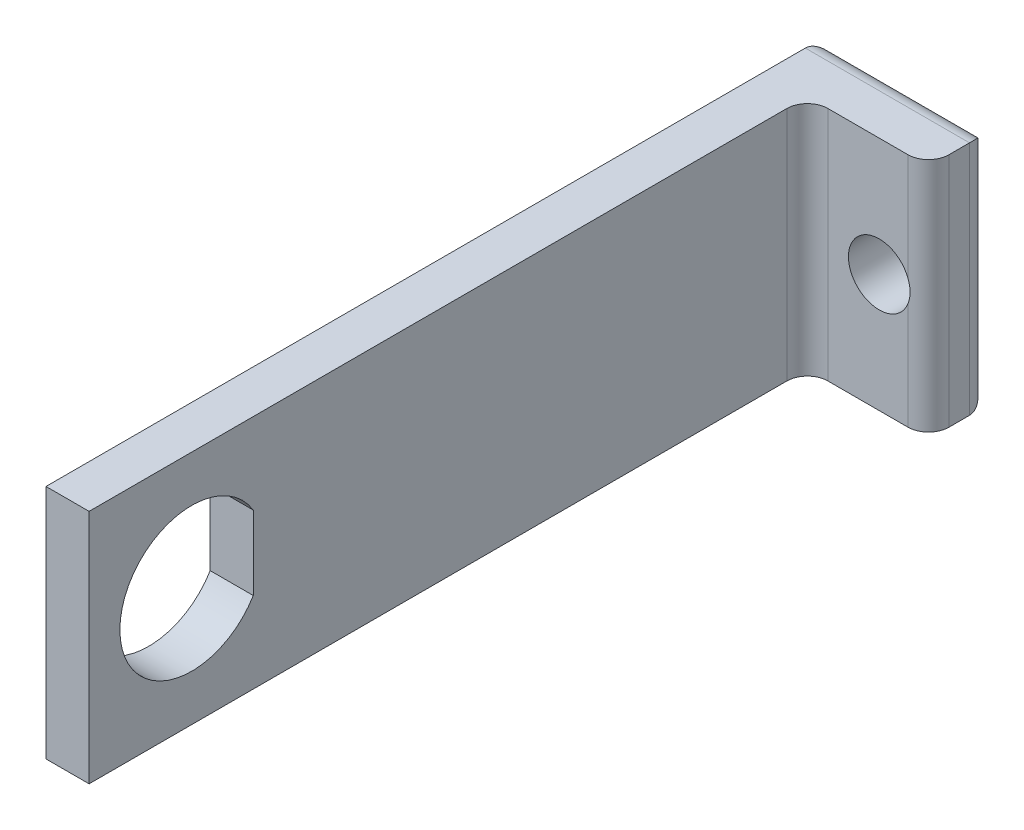
ISO-10303-21;
HEADER;
FILE_DESCRIPTION(('STEP AP214'),'2;1');
FILE_NAME('part.step','',(''),(''),'','','');
FILE_SCHEMA(('AUTOMOTIVE_DESIGN { 1 0 10303 214 1 1 1 1 }'));
ENDSEC;
DATA;
#1=APPLICATION_CONTEXT('core data for automotive mechanical design processes');
#2=APPLICATION_PROTOCOL_DEFINITION('international standard','automotive_design',2000,#1);
#3=PRODUCT_CONTEXT('',#1,'mechanical');
#4=PRODUCT('Part','Part','',(#3));
#5=PRODUCT_RELATED_PRODUCT_CATEGORY('part','',(#4));
#6=PRODUCT_DEFINITION_FORMATION('','',#4);
#7=PRODUCT_DEFINITION_CONTEXT('part definition',#1,'design');
#8=PRODUCT_DEFINITION('design','',#6,#7);
#9=PRODUCT_DEFINITION_SHAPE('','',#8);
#10=(LENGTH_UNIT() NAMED_UNIT(*) SI_UNIT(.MILLI.,.METRE.));
#11=(NAMED_UNIT(*) PLANE_ANGLE_UNIT() SI_UNIT($,.RADIAN.));
#12=(NAMED_UNIT(*) SI_UNIT($,.STERADIAN.) SOLID_ANGLE_UNIT());
#13=UNCERTAINTY_MEASURE_WITH_UNIT(LENGTH_MEASURE(1.E-05),#10,'distance_accuracy_value','');
#14=(GEOMETRIC_REPRESENTATION_CONTEXT(3) GLOBAL_UNCERTAINTY_ASSIGNED_CONTEXT((#13)) GLOBAL_UNIT_ASSIGNED_CONTEXT((#10,
#11,#12)) REPRESENTATION_CONTEXT('',''));
#15=CARTESIAN_POINT('',(0.,0.,0.));
#16=DIRECTION('',(0.,0.,1.));
#17=DIRECTION('',(1.,0.,0.));
#18=AXIS2_PLACEMENT_3D('',#15,#16,#17);
#19=CARTESIAN_POINT('',(-19.5,11.5,-3.));
#20=DIRECTION('',(1.,0.,0.));
#21=DIRECTION('',(0.,0.,-1.));
#22=AXIS2_PLACEMENT_3D('',#19,#20,#21);
#23=PLANE('',#22);
#24=DIRECTION('',(0.,-1.,0.));
#25=VECTOR('',#24,1.);
#26=CARTESIAN_POINT('',(-19.5,3.947224362268,27.));
#27=LINE('',#26,#25);
#28=CARTESIAN_POINT('',(-19.5,7.552775637732,27.));
#29=VERTEX_POINT('',#28);
#30=CARTESIAN_POINT('',(-19.5,3.947224362268,27.));
#31=VERTEX_POINT('',#30);
#32=EDGE_CURVE('E159',#29,#31,#27,.T.);
#33=ORIENTED_EDGE('',*,*,#32,.F.);
#34=CARTESIAN_POINT('',(-19.5,5.75,30.));
#35=DIRECTION('',(-1.,0.,0.));
#36=DIRECTION('',(0.,0.,1.));
#37=AXIS2_PLACEMENT_3D('',#34,#35,#36);
#38=CIRCLE('',#37,3.5);
#39=EDGE_CURVE('E153',#31,#29,#38,.T.);
#40=ORIENTED_EDGE('',*,*,#39,.F.);
#41=EDGE_LOOP('',(#33,#40));
#42=FACE_BOUND('',#41,.T.);
#43=DIRECTION('',(0.,0.,1.));
#44=VECTOR('',#43,1.);
#45=CARTESIAN_POINT('',(-19.5,11.5,-3.));
#46=LINE('',#45,#44);
#47=CARTESIAN_POINT('',(-19.5,11.5,-2.));
#48=VERTEX_POINT('',#47);
#49=CARTESIAN_POINT('',(-19.5,11.5,35.));
#50=VERTEX_POINT('',#49);
#51=EDGE_CURVE('E190',#48,#50,#46,.T.);
#52=ORIENTED_EDGE('',*,*,#51,.F.);
#53=DIRECTION('',(0.,-1.,0.));
#54=VECTOR('',#53,1.);
#55=CARTESIAN_POINT('',(-19.5,11.5,-2.));
#56=LINE('',#55,#54);
#57=CARTESIAN_POINT('',(-19.5,0.,-2.));
#58=VERTEX_POINT('',#57);
#59=EDGE_CURVE('E324',#48,#58,#56,.T.);
#60=ORIENTED_EDGE('',*,*,#59,.T.);
#61=DIRECTION('',(0.,0.,1.));
#62=VECTOR('',#61,1.);
#63=CARTESIAN_POINT('',(-19.5,0.,-3.));
#64=LINE('',#63,#62);
#65=CARTESIAN_POINT('',(-19.5,0.,35.));
#66=VERTEX_POINT('',#65);
#67=EDGE_CURVE('E189',#58,#66,#64,.T.);
#68=ORIENTED_EDGE('',*,*,#67,.T.);
#69=DIRECTION('',(0.,-1.,0.));
#70=VECTOR('',#69,1.);
#71=CARTESIAN_POINT('',(-19.5,11.5,35.));
#72=LINE('',#71,#70);
#73=EDGE_CURVE('E227',#50,#66,#72,.T.);
#74=ORIENTED_EDGE('',*,*,#73,.F.);
#75=EDGE_LOOP('',(#52,#60,#68,#74));
#76=FACE_BOUND('',#75,.T.);
#77=ADVANCED_FACE('F45',(#42,#76),#23,.F.);
#78=CARTESIAN_POINT('',(-19.5,11.5,35.));
#79=DIRECTION('',(0.,0.,-1.));
#80=DIRECTION('',(-1.,0.,0.));
#81=AXIS2_PLACEMENT_3D('',#78,#79,#80);
#82=PLANE('',#81);
#83=DIRECTION('',(1.,0.,0.));
#84=VECTOR('',#83,1.);
#85=CARTESIAN_POINT('',(-19.5,0.,35.));
#86=LINE('',#85,#84);
#87=CARTESIAN_POINT('',(-17.4,0.,35.));
#88=VERTEX_POINT('',#87);
#89=EDGE_CURVE('E212',#66,#88,#86,.T.);
#90=ORIENTED_EDGE('',*,*,#89,.T.);
#91=DIRECTION('',(0.,-1.,0.));
#92=VECTOR('',#91,1.);
#93=CARTESIAN_POINT('',(-17.4,11.5,35.));
#94=LINE('',#93,#92);
#95=CARTESIAN_POINT('',(-17.4,11.5,35.));
#96=VERTEX_POINT('',#95);
#97=EDGE_CURVE('E209',#96,#88,#94,.T.);
#98=ORIENTED_EDGE('',*,*,#97,.F.);
#99=DIRECTION('',(1.,0.,0.));
#100=VECTOR('',#99,1.);
#101=CARTESIAN_POINT('',(-19.5,11.5,35.));
#102=LINE('',#101,#100);
#103=EDGE_CURVE('E193',#50,#96,#102,.T.);
#104=ORIENTED_EDGE('',*,*,#103,.F.);
#105=ORIENTED_EDGE('',*,*,#73,.T.);
#106=EDGE_LOOP('',(#90,#98,#104,#105));
#107=FACE_BOUND('',#106,.T.);
#108=ADVANCED_FACE('F294',(#107),#82,.F.);
#109=CARTESIAN_POINT('',(-17.4,11.5,35.));
#110=DIRECTION('',(-1.,0.,0.));
#111=DIRECTION('',(0.,0.,1.));
#112=AXIS2_PLACEMENT_3D('',#109,#110,#111);
#113=PLANE('',#112);
#114=DIRECTION('',(0.,1.,0.));
#115=VECTOR('',#114,1.);
#116=CARTESIAN_POINT('',(-17.4,3.947224362268,27.));
#117=LINE('',#116,#115);
#118=CARTESIAN_POINT('',(-17.4,3.947224362268,27.));
#119=VERTEX_POINT('',#118);
#120=CARTESIAN_POINT('',(-17.4,7.552775637732,27.));
#121=VERTEX_POINT('',#120);
#122=EDGE_CURVE('E162',#119,#121,#117,.T.);
#123=ORIENTED_EDGE('',*,*,#122,.F.);
#124=CARTESIAN_POINT('',(-17.4,5.75,30.));
#125=DIRECTION('',(-1.,0.,0.));
#126=DIRECTION('',(0.,0.,1.));
#127=AXIS2_PLACEMENT_3D('',#124,#125,#126);
#128=CIRCLE('',#127,3.5);
#129=EDGE_CURVE('E150',#121,#119,#128,.F.);
#130=ORIENTED_EDGE('',*,*,#129,.F.);
#131=EDGE_LOOP('',(#123,#130));
#132=FACE_BOUND('',#131,.T.);
#133=DIRECTION('',(0.,0.,-1.));
#134=VECTOR('',#133,1.);
#135=CARTESIAN_POINT('',(-17.4,0.,35.));
#136=LINE('',#135,#134);
#137=CARTESIAN_POINT('',(-17.4,0.,1.));
#138=VERTEX_POINT('',#137);
#139=EDGE_CURVE('E215',#88,#138,#136,.T.);
#140=ORIENTED_EDGE('',*,*,#139,.T.);
#141=DIRECTION('',(0.,-1.,0.));
#142=VECTOR('',#141,1.);
#143=CARTESIAN_POINT('',(-17.4,11.5,1.));
#144=LINE('',#143,#142);
#145=CARTESIAN_POINT('',(-17.4,11.5,1.));
#146=VERTEX_POINT('',#145);
#147=EDGE_CURVE('E349',#138,#146,#144,.F.);
#148=ORIENTED_EDGE('',*,*,#147,.T.);
#149=DIRECTION('',(0.,0.,-1.));
#150=VECTOR('',#149,1.);
#151=CARTESIAN_POINT('',(-17.4,11.5,35.));
#152=LINE('',#151,#150);
#153=EDGE_CURVE('E197',#96,#146,#152,.T.);
#154=ORIENTED_EDGE('',*,*,#153,.F.);
#155=ORIENTED_EDGE('',*,*,#97,.T.);
#156=EDGE_LOOP('',(#140,#148,#154,#155));
#157=FACE_BOUND('',#156,.T.);
#158=ADVANCED_FACE('F168',(#132,#157),#113,.F.);
#159=CARTESIAN_POINT('',(-17.4,11.5,0.));
#160=DIRECTION('',(0.,0.,-1.));
#161=DIRECTION('',(-1.,0.,0.));
#162=AXIS2_PLACEMENT_3D('',#159,#160,#161);
#163=PLANE('',#162);
#164=DIRECTION('',(1.,0.,0.));
#165=VECTOR('',#164,1.);
#166=CARTESIAN_POINT('',(-17.4,0.,0.));
#167=LINE('',#166,#165);
#168=CARTESIAN_POINT('',(-16.4,0.,0.));
#169=VERTEX_POINT('',#168);
#170=CARTESIAN_POINT('',(-12.5,0.,0.));
#171=VERTEX_POINT('',#170);
#172=EDGE_CURVE('E218',#169,#171,#167,.T.);
#173=ORIENTED_EDGE('',*,*,#172,.T.);
#174=DIRECTION('',(0.,-1.,0.));
#175=VECTOR('',#174,1.);
#176=CARTESIAN_POINT('',(-12.5,11.5,0.));
#177=LINE('',#176,#175);
#178=CARTESIAN_POINT('',(-12.5,5.21148351928656,0.));
#179=VERTEX_POINT('',#178);
#180=EDGE_CURVE('E346',#171,#179,#177,.F.);
#181=ORIENTED_EDGE('',*,*,#180,.T.);
#182=CARTESIAN_POINT('',(-13.9,5.75,0.));
#183=DIRECTION('',(0.,0.,-1.));
#184=DIRECTION('',(-1.,0.,0.));
#185=AXIS2_PLACEMENT_3D('',#182,#183,#184);
#186=CIRCLE('',#185,1.5);
#187=CARTESIAN_POINT('',(-12.5,6.28851648071344,0.));
#188=VERTEX_POINT('',#187);
#189=EDGE_CURVE('E185',#188,#179,#186,.F.);
#190=ORIENTED_EDGE('',*,*,#189,.F.);
#191=DIRECTION('',(0.,-1.,0.));
#192=VECTOR('',#191,1.);
#193=CARTESIAN_POINT('',(-12.5,11.5,0.));
#194=LINE('',#193,#192);
#195=CARTESIAN_POINT('',(-12.5,11.5,0.));
#196=VERTEX_POINT('',#195);
#197=EDGE_CURVE('E339',#188,#196,#194,.F.);
#198=ORIENTED_EDGE('',*,*,#197,.T.);
#199=DIRECTION('',(1.,0.,0.));
#200=VECTOR('',#199,1.);
#201=CARTESIAN_POINT('',(-17.4,11.5,0.));
#202=LINE('',#201,#200);
#203=CARTESIAN_POINT('',(-16.4,11.5,0.));
#204=VERTEX_POINT('',#203);
#205=EDGE_CURVE('E201',#204,#196,#202,.T.);
#206=ORIENTED_EDGE('',*,*,#205,.F.);
#207=DIRECTION('',(0.,-1.,0.));
#208=VECTOR('',#207,1.);
#209=CARTESIAN_POINT('',(-16.4,0.,0.));
#210=LINE('',#209,#208);
#211=EDGE_CURVE('E334',#204,#169,#210,.T.);
#212=ORIENTED_EDGE('',*,*,#211,.T.);
#213=EDGE_LOOP('',(#173,#181,#190,#198,#206,#212));
#214=FACE_BOUND('',#213,.T.);
#215=ADVANCED_FACE('F287',(#214),#163,.F.);
#216=CARTESIAN_POINT('',(-11.5,11.5,-3.));
#217=DIRECTION('',(-1.,0.,0.));
#218=DIRECTION('',(0.,0.,1.));
#219=AXIS2_PLACEMENT_3D('',#216,#217,#218);
#220=PLANE('',#219);
#221=DIRECTION('',(0.,0.,-1.));
#222=VECTOR('',#221,1.);
#223=CARTESIAN_POINT('',(-11.5,0.,-3.));
#224=LINE('',#223,#222);
#225=CARTESIAN_POINT('',(-11.5,0.,-1.));
#226=VERTEX_POINT('',#225);
#227=CARTESIAN_POINT('',(-11.5,0.,-2.));
#228=VERTEX_POINT('',#227);
#229=EDGE_CURVE('E194',#226,#228,#224,.T.);
#230=ORIENTED_EDGE('',*,*,#229,.T.);
#231=DIRECTION('',(0.,-1.,0.));
#232=VECTOR('',#231,1.);
#233=CARTESIAN_POINT('',(-11.5,11.5,-2.));
#234=LINE('',#233,#232);
#235=CARTESIAN_POINT('',(-11.5,11.5,-2.));
#236=VERTEX_POINT('',#235);
#237=EDGE_CURVE('E362',#228,#236,#234,.F.);
#238=ORIENTED_EDGE('',*,*,#237,.T.);
#239=DIRECTION('',(0.,0.,-1.));
#240=VECTOR('',#239,1.);
#241=CARTESIAN_POINT('',(-11.5,11.5,-3.));
#242=LINE('',#241,#240);
#243=CARTESIAN_POINT('',(-11.5,11.5,-1.));
#244=VERTEX_POINT('',#243);
#245=EDGE_CURVE('E205',#244,#236,#242,.T.);
#246=ORIENTED_EDGE('',*,*,#245,.F.);
#247=DIRECTION('',(0.,-1.,0.));
#248=VECTOR('',#247,1.);
#249=CARTESIAN_POINT('',(-11.5,11.5,-1.));
#250=LINE('',#249,#248);
#251=EDGE_CURVE('E373',#244,#226,#250,.T.);
#252=ORIENTED_EDGE('',*,*,#251,.T.);
#253=EDGE_LOOP('',(#230,#238,#246,#252));
#254=FACE_BOUND('',#253,.T.);
#255=ADVANCED_FACE('F283',(#254),#220,.F.);
#256=CARTESIAN_POINT('',(-19.5,11.5,-3.));
#257=DIRECTION('',(0.,0.,1.));
#258=DIRECTION('',(1.,0.,0.));
#259=AXIS2_PLACEMENT_3D('',#256,#257,#258);
#260=PLANE('',#259);
#261=DIRECTION('',(-1.,0.,0.));
#262=VECTOR('',#261,1.);
#263=CARTESIAN_POINT('',(-11.5,10.5,-3.));
#264=LINE('',#263,#262);
#265=CARTESIAN_POINT('',(-18.5,10.5,-3.));
#266=VERTEX_POINT('',#265);
#267=CARTESIAN_POINT('',(-12.5,10.5,-3.));
#268=VERTEX_POINT('',#267);
#269=EDGE_CURVE('E237',#266,#268,#264,.F.);
#270=ORIENTED_EDGE('',*,*,#269,.T.);
#271=DIRECTION('',(0.,-1.,0.));
#272=VECTOR('',#271,1.);
#273=CARTESIAN_POINT('',(-12.5,11.5,-3.));
#274=LINE('',#273,#272);
#275=CARTESIAN_POINT('',(-12.5,6.28851648071344,-3.));
#276=VERTEX_POINT('',#275);
#277=EDGE_CURVE('E243',#268,#276,#274,.T.);
#278=ORIENTED_EDGE('',*,*,#277,.T.);
#279=CARTESIAN_POINT('',(-13.9,5.75,-3.));
#280=DIRECTION('',(0.,0.,-1.));
#281=DIRECTION('',(-1.,0.,0.));
#282=AXIS2_PLACEMENT_3D('',#279,#280,#281);
#283=CIRCLE('',#282,1.5);
#284=CARTESIAN_POINT('',(-12.5,5.21148351928656,-3.));
#285=VERTEX_POINT('',#284);
#286=EDGE_CURVE('E166',#285,#276,#283,.T.);
#287=ORIENTED_EDGE('',*,*,#286,.F.);
#288=DIRECTION('',(0.,-1.,0.));
#289=VECTOR('',#288,1.);
#290=CARTESIAN_POINT('',(-12.5,11.5,-3.));
#291=LINE('',#290,#289);
#292=CARTESIAN_POINT('',(-12.5,1.,-3.));
#293=VERTEX_POINT('',#292);
#294=EDGE_CURVE('E240',#285,#293,#291,.T.);
#295=ORIENTED_EDGE('',*,*,#294,.T.);
#296=DIRECTION('',(-1.,0.,0.));
#297=VECTOR('',#296,1.);
#298=CARTESIAN_POINT('',(-19.5,1.,-3.));
#299=LINE('',#298,#297);
#300=CARTESIAN_POINT('',(-18.5,1.,-3.));
#301=VERTEX_POINT('',#300);
#302=EDGE_CURVE('E231',#293,#301,#299,.T.);
#303=ORIENTED_EDGE('',*,*,#302,.T.);
#304=DIRECTION('',(0.,-1.,0.));
#305=VECTOR('',#304,1.);
#306=CARTESIAN_POINT('',(-18.5,11.5,-3.));
#307=LINE('',#306,#305);
#308=EDGE_CURVE('E234',#301,#266,#307,.F.);
#309=ORIENTED_EDGE('',*,*,#308,.T.);
#310=EDGE_LOOP('',(#270,#278,#287,#295,#303,#309));
#311=FACE_BOUND('',#310,.T.);
#312=ADVANCED_FACE('F277',(#311),#260,.F.);
#313=CARTESIAN_POINT('',(0.,11.5,0.));
#314=DIRECTION('',(0.,1.,0.));
#315=DIRECTION('',(0.,0.,1.));
#316=AXIS2_PLACEMENT_3D('',#313,#314,#315);
#317=PLANE('',#316);
#318=ORIENTED_EDGE('',*,*,#245,.T.);
#319=DIRECTION('',(-1.,0.,0.));
#320=VECTOR('',#319,1.);
#321=CARTESIAN_POINT('',(-19.5,11.5,-2.));
#322=LINE('',#321,#320);
#323=EDGE_CURVE('E364',#236,#48,#322,.T.);
#324=ORIENTED_EDGE('',*,*,#323,.T.);
#325=ORIENTED_EDGE('',*,*,#51,.T.);
#326=ORIENTED_EDGE('',*,*,#103,.T.);
#327=ORIENTED_EDGE('',*,*,#153,.T.);
#328=CARTESIAN_POINT('',(-16.4,11.5,1.));
#329=DIRECTION('',(0.,1.,0.));
#330=DIRECTION('',(0.,0.,1.));
#331=AXIS2_PLACEMENT_3D('',#328,#329,#330);
#332=CIRCLE('',#331,1.);
#333=EDGE_CURVE('E11',#146,#204,#332,.F.);
#334=ORIENTED_EDGE('',*,*,#333,.T.);
#335=ORIENTED_EDGE('',*,*,#205,.T.);
#336=CARTESIAN_POINT('',(-12.5,11.5,-1.));
#337=DIRECTION('',(0.,1.,0.));
#338=DIRECTION('',(0.,0.,1.));
#339=AXIS2_PLACEMENT_3D('',#336,#337,#338);
#340=CIRCLE('',#339,1.);
#341=EDGE_CURVE('E367',#196,#244,#340,.T.);
#342=ORIENTED_EDGE('',*,*,#341,.T.);
#343=EDGE_LOOP('',(#318,#324,#325,#326,#327,#334,#335,#342));
#344=FACE_BOUND('',#343,.T.);
#345=ADVANCED_FACE('F273',(#344),#317,.T.);
#346=CARTESIAN_POINT('',(0.,0.,0.));
#347=DIRECTION('',(0.,1.,0.));
#348=DIRECTION('',(0.,0.,1.));
#349=AXIS2_PLACEMENT_3D('',#346,#347,#348);
#350=PLANE('',#349);
#351=ORIENTED_EDGE('',*,*,#67,.F.);
#352=DIRECTION('',(-1.,0.,0.));
#353=VECTOR('',#352,1.);
#354=CARTESIAN_POINT('',(0.,0.,-2.));
#355=LINE('',#354,#353);
#356=EDGE_CURVE('E329',#58,#228,#355,.F.);
#357=ORIENTED_EDGE('',*,*,#356,.T.);
#358=ORIENTED_EDGE('',*,*,#229,.F.);
#359=CARTESIAN_POINT('',(-12.5,0.,-1.));
#360=DIRECTION('',(0.,1.,0.));
#361=DIRECTION('',(0.,0.,1.));
#362=AXIS2_PLACEMENT_3D('',#359,#360,#361);
#363=CIRCLE('',#362,1.);
#364=EDGE_CURVE('E68',#226,#171,#363,.F.);
#365=ORIENTED_EDGE('',*,*,#364,.T.);
#366=ORIENTED_EDGE('',*,*,#172,.F.);
#367=CARTESIAN_POINT('',(-16.4,0.,1.));
#368=DIRECTION('',(0.,1.,0.));
#369=DIRECTION('',(0.,0.,1.));
#370=AXIS2_PLACEMENT_3D('',#367,#368,#369);
#371=CIRCLE('',#370,1.);
#372=EDGE_CURVE('E55',#169,#138,#371,.T.);
#373=ORIENTED_EDGE('',*,*,#372,.T.);
#374=ORIENTED_EDGE('',*,*,#139,.F.);
#375=ORIENTED_EDGE('',*,*,#89,.F.);
#376=EDGE_LOOP('',(#351,#357,#358,#365,#366,#373,#374,#375));
#377=FACE_BOUND('',#376,.T.);
#378=ADVANCED_FACE('F270',(#377),#350,.F.);
#379=CARTESIAN_POINT('',(-13.9,5.75,35.001));
#380=DIRECTION('',(0.,0.,-1.));
#381=DIRECTION('',(-1.,0.,0.));
#382=AXIS2_PLACEMENT_3D('',#379,#380,#381);
#383=CYLINDRICAL_SURFACE('',#382,1.5);
#384=ORIENTED_EDGE('',*,*,#286,.T.);
#385=CARTESIAN_POINT('',(-12.5,6.28851648071344,-3.));
#386=CARTESIAN_POINT('',(-12.4847524389628,6.24888809709415,-2.9999833071484));
#387=CARTESIAN_POINT('',(-12.4711968424512,6.20861419954741,-2.99965076639667));
#388=CARTESIAN_POINT('',(-12.4475462421582,6.12706431958614,-2.99869788182376));
#389=CARTESIAN_POINT('',(-12.4374513420944,6.08578830717777,-2.99807752937814));
#390=CARTESIAN_POINT('',(-12.4207902623054,6.00247825190098,-2.99689228346156));
#391=CARTESIAN_POINT('',(-12.4142281046814,5.9604434010928,-2.99632745379972));
#392=CARTESIAN_POINT('',(-12.4046949271355,5.87597911515038,-2.99545846176344));
#393=CARTESIAN_POINT('',(-12.4017235756206,5.83354971681532,-2.99515427532067));
#394=CARTESIAN_POINT('',(-12.3982581028327,5.70677619568702,-2.99482455883384));
#395=CARTESIAN_POINT('',(-12.403070569133,5.62223038628245,-2.99536691017937));
#396=CARTESIAN_POINT('',(-12.4268155784703,5.45536723976206,-2.99738528797825));
#397=CARTESIAN_POINT('',(-12.4457095353143,5.37304444871404,-2.99885876128984));
#398=CARTESIAN_POINT('',(-12.4757037720479,5.27926736023096,-2.99971357748911));
#399=CARTESIAN_POINT('',(-12.480291751397,5.26560677575193,-2.99981683556918));
#400=CARTESIAN_POINT('',(-12.4898553249586,5.23843517698418,-2.9999603527412));
#401=CARTESIAN_POINT('',(-12.4948305738705,5.22492404144739,-3.00000066729494));
#402=CARTESIAN_POINT('',(-12.5,5.21148351928656,-3.));
#403=B_SPLINE_CURVE_WITH_KNOTS('',3,(#385,#386,#387,#388,#389,#390,#391,#392,#393,#394,#395,
#396,#397,#398,#399,#400,#401,#402),.UNSPECIFIED.,.F.,.F.,(4,2,2,2,2,2,2,2,4),(0.,
0.127334925114758,0.254673666142173,0.382157080021365,0.509628720549113,0.762409365491733,
1.0144998743038,1.05772998228611,1.10092197714101),.UNSPECIFIED.);
#404=EDGE_CURVE('E255',#276,#285,#403,.T.);
#405=ORIENTED_EDGE('',*,*,#404,.T.);
#406=EDGE_LOOP('',(#384,#405));
#407=FACE_BOUND('',#406,.T.);
#408=ORIENTED_EDGE('',*,*,#189,.T.);
#409=CARTESIAN_POINT('',(-12.5,5.21148351928656,0.));
#410=CARTESIAN_POINT('',(-12.4847524389628,5.25111190290585,-1.66928515980216E-05));
#411=CARTESIAN_POINT('',(-12.4711968424512,5.29138580045258,-0.000349233603334194));
#412=CARTESIAN_POINT('',(-12.4475462421582,5.37293568041385,-0.00130211817623948));
#413=CARTESIAN_POINT('',(-12.4374513420944,5.41421169282223,-0.00192247062185586));
#414=CARTESIAN_POINT('',(-12.4207902623054,5.49752174809902,-0.00310771653843662));
#415=CARTESIAN_POINT('',(-12.4142281046814,5.5395565989072,-0.00367254620027921));
#416=CARTESIAN_POINT('',(-12.4046949271355,5.62402088484961,-0.00454153823655973));
#417=CARTESIAN_POINT('',(-12.4017235756206,5.66645028318468,-0.00484572467933216));
#418=CARTESIAN_POINT('',(-12.3982581028327,5.79322380431297,-0.00517544116616162));
#419=CARTESIAN_POINT('',(-12.403070569133,5.87776961371755,-0.00463308982063139));
#420=CARTESIAN_POINT('',(-12.4268155784703,6.04463276023794,-0.00261471202175018));
#421=CARTESIAN_POINT('',(-12.4457095353143,6.12695555128596,-0.00114123871016219));
#422=CARTESIAN_POINT('',(-12.4757037720479,6.22073263976904,-0.000286422510892083));
#423=CARTESIAN_POINT('',(-12.480291751397,6.23439322424807,-0.000183164430822718));
#424=CARTESIAN_POINT('',(-12.4898553249586,6.26156482301582,-3.96472587988669E-05));
#425=CARTESIAN_POINT('',(-12.4948305738705,6.27507595855262,6.67294937058742E-07));
#426=CARTESIAN_POINT('',(-12.5,6.28851648071344,0.));
#427=B_SPLINE_CURVE_WITH_KNOTS('',3,(#409,#410,#411,#412,#413,#414,#415,#416,#417,#418,#419,
#420,#421,#422,#423,#424,#425,#426),.UNSPECIFIED.,.F.,.F.,(4,2,2,2,2,2,2,2,4),(0.,
0.127334925114759,0.254673666142174,0.382157080021366,0.509628720549114,0.762409365491734,
1.0144998743038,1.05772998228611,1.10092197714102),.UNSPECIFIED.);
#428=EDGE_CURVE('E247',#179,#188,#427,.T.);
#429=ORIENTED_EDGE('',*,*,#428,.T.);
#430=EDGE_LOOP('',(#408,#429));
#431=FACE_BOUND('',#430,.T.);
#432=ADVANCED_FACE('F265',(#407,#431),#383,.F.);
#433=CARTESIAN_POINT('',(-11.499,5.75,30.));
#434=DIRECTION('',(-1.,0.,0.));
#435=DIRECTION('',(0.,0.,1.));
#436=AXIS2_PLACEMENT_3D('',#433,#434,#435);
#437=CYLINDRICAL_SURFACE('',#436,3.5);
#438=ORIENTED_EDGE('',*,*,#129,.T.);
#439=DIRECTION('',(-1.,0.,0.));
#440=VECTOR('',#439,1.);
#441=CARTESIAN_POINT('',(-11.499,3.947224362268,27.));
#442=LINE('',#441,#440);
#443=EDGE_CURVE('E158',#119,#31,#442,.T.);
#444=ORIENTED_EDGE('',*,*,#443,.T.);
#445=ORIENTED_EDGE('',*,*,#39,.T.);
#446=DIRECTION('',(-1.,0.,0.));
#447=VECTOR('',#446,1.);
#448=CARTESIAN_POINT('',(-11.499,7.552775637732,27.));
#449=LINE('',#448,#447);
#450=EDGE_CURVE('E146',#121,#29,#449,.T.);
#451=ORIENTED_EDGE('',*,*,#450,.F.);
#452=EDGE_LOOP('',(#438,#444,#445,#451));
#453=FACE_BOUND('',#452,.T.);
#454=ADVANCED_FACE('F148',(#453),#437,.F.);
#455=CARTESIAN_POINT('',(-11.499,3.947224362268,27.));
#456=DIRECTION('',(0.,0.,-1.));
#457=DIRECTION('',(-1.,0.,0.));
#458=AXIS2_PLACEMENT_3D('',#455,#456,#457);
#459=PLANE('',#458);
#460=ORIENTED_EDGE('',*,*,#122,.T.);
#461=ORIENTED_EDGE('',*,*,#450,.T.);
#462=ORIENTED_EDGE('',*,*,#32,.T.);
#463=ORIENTED_EDGE('',*,*,#443,.F.);
#464=EDGE_LOOP('',(#460,#461,#462,#463));
#465=FACE_BOUND('',#464,.T.);
#466=ADVANCED_FACE('F163',(#465),#459,.F.);
#467=CARTESIAN_POINT('',(-18.5,11.5,-2.));
#468=DIRECTION('',(0.,-1.,0.));
#469=DIRECTION('',(0.,0.,-1.));
#470=AXIS2_PLACEMENT_3D('',#467,#468,#469);
#471=CYLINDRICAL_SURFACE('',#470,1.);
#472=CARTESIAN_POINT('',(-18.5,1.,-2.));
#473=DIRECTION('',(-0.707106781186547,0.707106781186547,0.));
#474=DIRECTION('',(-0.707106781186547,-0.707106781186547,0.));
#475=AXIS2_PLACEMENT_3D('',#472,#473,#474);
#476=ELLIPSE('',#475,1.41421356237309,1.);
#477=EDGE_CURVE('E176',#58,#301,#476,.F.);
#478=ORIENTED_EDGE('',*,*,#477,.F.);
#479=ORIENTED_EDGE('',*,*,#59,.F.);
#480=CARTESIAN_POINT('',(-18.5,10.5,-2.));
#481=DIRECTION('',(-0.707106781186547,-0.707106781186547,0.));
#482=DIRECTION('',(0.707106781186547,-0.707106781186547,0.));
#483=AXIS2_PLACEMENT_3D('',#480,#481,#482);
#484=ELLIPSE('',#483,1.41421356237309,1.);
#485=EDGE_CURVE('E49',#266,#48,#484,.F.);
#486=ORIENTED_EDGE('',*,*,#485,.F.);
#487=ORIENTED_EDGE('',*,*,#308,.F.);
#488=EDGE_LOOP('',(#478,#479,#486,#487));
#489=FACE_BOUND('',#488,.T.);
#490=ADVANCED_FACE('F311',(#489),#471,.T.);
#491=CARTESIAN_POINT('',(0.,10.5,-2.));
#492=DIRECTION('',(1.,0.,0.));
#493=DIRECTION('',(0.,0.,-1.));
#494=AXIS2_PLACEMENT_3D('',#491,#492,#493);
#495=CYLINDRICAL_SURFACE('',#494,1.);
#496=ORIENTED_EDGE('',*,*,#485,.T.);
#497=ORIENTED_EDGE('',*,*,#323,.F.);
#498=CARTESIAN_POINT('',(-12.5,10.5,-2.));
#499=DIRECTION('',(0.707106781186547,-0.707106781186547,0.));
#500=DIRECTION('',(0.707106781186547,0.707106781186547,0.));
#501=AXIS2_PLACEMENT_3D('',#498,#499,#500);
#502=ELLIPSE('',#501,1.41421356237309,1.);
#503=EDGE_CURVE('E327',#268,#236,#502,.T.);
#504=ORIENTED_EDGE('',*,*,#503,.F.);
#505=ORIENTED_EDGE('',*,*,#269,.F.);
#506=EDGE_LOOP('',(#496,#497,#504,#505));
#507=FACE_BOUND('',#506,.T.);
#508=ADVANCED_FACE('F308',(#507),#495,.T.);
#509=CARTESIAN_POINT('',(-19.5,1.,-2.));
#510=DIRECTION('',(-1.,0.,0.));
#511=DIRECTION('',(0.,0.,1.));
#512=AXIS2_PLACEMENT_3D('',#509,#510,#511);
#513=CYLINDRICAL_SURFACE('',#512,1.);
#514=ORIENTED_EDGE('',*,*,#477,.T.);
#515=ORIENTED_EDGE('',*,*,#302,.F.);
#516=CARTESIAN_POINT('',(-12.5,1.,-2.));
#517=DIRECTION('',(-0.707106781186547,-0.707106781186547,0.));
#518=DIRECTION('',(-0.707106781186547,0.707106781186547,0.));
#519=AXIS2_PLACEMENT_3D('',#516,#517,#518);
#520=ELLIPSE('',#519,1.41421356237309,1.);
#521=EDGE_CURVE('E331',#228,#293,#520,.F.);
#522=ORIENTED_EDGE('',*,*,#521,.F.);
#523=ORIENTED_EDGE('',*,*,#356,.F.);
#524=EDGE_LOOP('',(#514,#515,#522,#523));
#525=FACE_BOUND('',#524,.T.);
#526=ADVANCED_FACE('F304',(#525),#513,.T.);
#527=CARTESIAN_POINT('',(-12.5,11.5,-2.));
#528=DIRECTION('',(0.,-1.,0.));
#529=DIRECTION('',(0.,0.,-1.));
#530=AXIS2_PLACEMENT_3D('',#527,#528,#529);
#531=CYLINDRICAL_SURFACE('',#530,1.);
#532=ORIENTED_EDGE('',*,*,#503,.T.);
#533=ORIENTED_EDGE('',*,*,#237,.F.);
#534=ORIENTED_EDGE('',*,*,#521,.T.);
#535=ORIENTED_EDGE('',*,*,#294,.F.);
#536=ORIENTED_EDGE('',*,*,#404,.F.);
#537=ORIENTED_EDGE('',*,*,#277,.F.);
#538=EDGE_LOOP('',(#532,#533,#534,#535,#536,#537));
#539=FACE_BOUND('',#538,.T.);
#540=ADVANCED_FACE('F300',(#539),#531,.T.);
#541=CARTESIAN_POINT('',(-12.5,11.5,-1.));
#542=DIRECTION('',(0.,-1.,0.));
#543=DIRECTION('',(0.,0.,-1.));
#544=AXIS2_PLACEMENT_3D('',#541,#542,#543);
#545=CYLINDRICAL_SURFACE('',#544,1.);
#546=ORIENTED_EDGE('',*,*,#428,.F.);
#547=ORIENTED_EDGE('',*,*,#180,.F.);
#548=ORIENTED_EDGE('',*,*,#364,.F.);
#549=ORIENTED_EDGE('',*,*,#251,.F.);
#550=ORIENTED_EDGE('',*,*,#341,.F.);
#551=ORIENTED_EDGE('',*,*,#197,.F.);
#552=EDGE_LOOP('',(#546,#547,#548,#549,#550,#551));
#553=FACE_BOUND('',#552,.T.);
#554=ADVANCED_FACE('F262',(#553),#545,.T.);
#555=CARTESIAN_POINT('',(-16.4,11.5,1.));
#556=DIRECTION('',(0.,1.,0.));
#557=DIRECTION('',(0.,0.,1.));
#558=AXIS2_PLACEMENT_3D('',#555,#556,#557);
#559=CYLINDRICAL_SURFACE('',#558,1.);
#560=ORIENTED_EDGE('',*,*,#333,.F.);
#561=ORIENTED_EDGE('',*,*,#147,.F.);
#562=ORIENTED_EDGE('',*,*,#372,.F.);
#563=ORIENTED_EDGE('',*,*,#211,.F.);
#564=EDGE_LOOP('',(#560,#561,#562,#563));
#565=FACE_BOUND('',#564,.T.);
#566=ADVANCED_FACE('F47',(#565),#559,.F.);
#567=CLOSED_SHELL('',(#77,#108,#158,#215,#255,#312,#345,#378,#432,#454,#466,#490,#508,#526,#540,
#554,#566));
#568=MANIFOLD_SOLID_BREP('B2',#567);
#569=ADVANCED_BREP_SHAPE_REPRESENTATION('',(#18,#568),#14);
#570=SHAPE_DEFINITION_REPRESENTATION(#9,#569);
ENDSEC;
END-ISO-10303-21;
